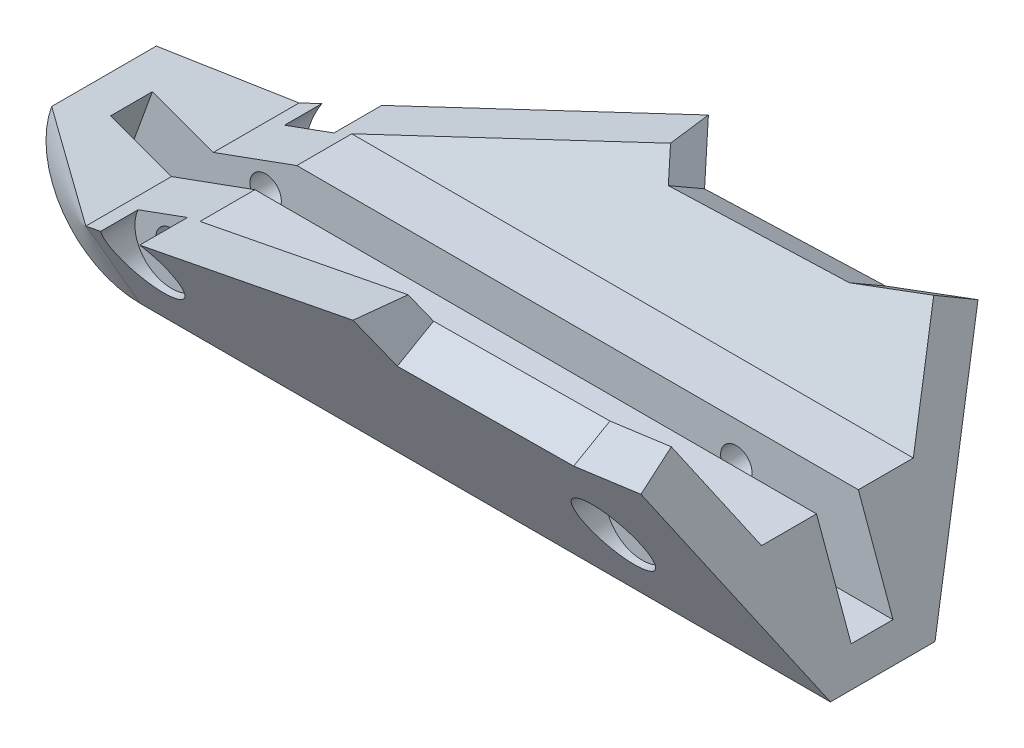
ISO-10303-21;
HEADER;
FILE_DESCRIPTION(('STEP AP214'),'2;1');
FILE_NAME('part.step','',(''),(''),'','','');
FILE_SCHEMA(('AUTOMOTIVE_DESIGN { 1 0 10303 214 1 1 1 1 }'));
ENDSEC;
DATA;
#1=APPLICATION_CONTEXT('core data for automotive mechanical design processes');
#2=APPLICATION_PROTOCOL_DEFINITION('international standard','automotive_design',2000,#1);
#3=PRODUCT_CONTEXT('',#1,'mechanical');
#4=PRODUCT('Part','Part','',(#3));
#5=PRODUCT_RELATED_PRODUCT_CATEGORY('part','',(#4));
#6=PRODUCT_DEFINITION_FORMATION('','',#4);
#7=PRODUCT_DEFINITION_CONTEXT('part definition',#1,'design');
#8=PRODUCT_DEFINITION('design','',#6,#7);
#9=PRODUCT_DEFINITION_SHAPE('','',#8);
#10=(LENGTH_UNIT() NAMED_UNIT(*) SI_UNIT(.MILLI.,.METRE.));
#11=(NAMED_UNIT(*) PLANE_ANGLE_UNIT() SI_UNIT($,.RADIAN.));
#12=(NAMED_UNIT(*) SI_UNIT($,.STERADIAN.) SOLID_ANGLE_UNIT());
#13=UNCERTAINTY_MEASURE_WITH_UNIT(LENGTH_MEASURE(1.E-05),#10,'distance_accuracy_value','');
#14=(GEOMETRIC_REPRESENTATION_CONTEXT(3) GLOBAL_UNCERTAINTY_ASSIGNED_CONTEXT((#13)) GLOBAL_UNIT_ASSIGNED_CONTEXT((#10,
#11,#12)) REPRESENTATION_CONTEXT('',''));
#15=CARTESIAN_POINT('',(0.,0.,0.));
#16=DIRECTION('',(0.,0.,1.));
#17=DIRECTION('',(1.,0.,0.));
#18=AXIS2_PLACEMENT_3D('',#15,#16,#17);
#19=CARTESIAN_POINT('',(66.,0.,-5.));
#20=DIRECTION('',(0.,0.500000000000001,0.866025403784438));
#21=DIRECTION('',(0.,-0.866025403784438,0.500000000000001));
#22=AXIS2_PLACEMENT_3D('',#19,#20,#21);
#23=PLANE('',#22);
#24=CARTESIAN_POINT('',(50.,8.23,-9.75159271543063));
#25=DIRECTION('',(0.,0.500000000000001,0.866025403784438));
#26=DIRECTION('',(0.,0.866025403784438,-0.500000000000001));
#27=AXIS2_PLACEMENT_3D('',#24,#25,#26);
#28=ELLIPSE('',#27,4.04145188432738,3.5);
#29=CARTESIAN_POINT('',(50.,11.73,-11.7723186575943));
#30=VERTEX_POINT('',#29);
#31=EDGE_CURVE('E311',#30,#30,#28,.T.);
#32=ORIENTED_EDGE('',*,*,#31,.T.);
#33=EDGE_LOOP('',(#32));
#34=FACE_BOUND('',#33,.T.);
#35=DIRECTION('',(0.38744925241058,-0.798381054136971,0.460945516521879));
#36=VECTOR('',#35,1.);
#37=CARTESIAN_POINT('',(32.3396465532428,20.7706687320701,-16.9919511837093));
#38=LINE('',#37,#36);
#39=CARTESIAN_POINT('',(32.3396465532428,20.7706687320701,-16.9919511837092));
#40=VERTEX_POINT('',#39);
#41=CARTESIAN_POINT('',(34.2768928152956,16.7787634613853,-14.6872236010999));
#42=VERTEX_POINT('',#41);
#43=EDGE_CURVE('E64',#40,#42,#38,.T.);
#44=ORIENTED_EDGE('',*,*,#43,.T.);
#45=DIRECTION('',(0.999659898363768,0.0225846342123478,-0.0130392446420483));
#46=VECTOR('',#45,1.);
#47=CARTESIAN_POINT('',(34.2768928152956,16.7787634613853,-14.6872236010999));
#48=LINE('',#47,#46);
#49=CARTESIAN_POINT('',(51.3645059177518,17.1648122486906,-14.9101089723709));
#50=VERTEX_POINT('',#49);
#51=EDGE_CURVE('E264',#42,#50,#48,.T.);
#52=ORIENTED_EDGE('',*,*,#51,.T.);
#53=DIRECTION('',(0.953741925422946,0.26035025401927,-0.150313289241614));
#54=VECTOR('',#53,1.);
#55=CARTESIAN_POINT('',(51.3645059177518,17.1648122486906,-14.9101089723709));
#56=LINE('',#55,#54);
#57=CARTESIAN_POINT('',(58.9944413211353,19.2476142808447,-16.1126152863038));
#58=VERTEX_POINT('',#57);
#59=EDGE_CURVE('E261',#50,#58,#56,.T.);
#60=ORIENTED_EDGE('',*,*,#59,.T.);
#61=DIRECTION('',(-0.300626578483226,0.825964736070554,-0.476870962711474));
#62=VECTOR('',#61,1.);
#63=CARTESIAN_POINT('',(66.,0.,-5.));
#64=LINE('',#63,#62);
#65=CARTESIAN_POINT('',(66.,0.,-5.));
#66=VERTEX_POINT('',#65);
#67=EDGE_CURVE('E360',#66,#58,#64,.T.);
#68=ORIENTED_EDGE('',*,*,#67,.F.);
#69=DIRECTION('',(-1.,0.,0.));
#70=VECTOR('',#69,1.);
#71=CARTESIAN_POINT('',(66.,0.,-5.));
#72=LINE('',#71,#70);
#73=CARTESIAN_POINT('',(0.,0.,-5.));
#74=VERTEX_POINT('',#73);
#75=EDGE_CURVE('E397',#66,#74,#72,.T.);
#76=ORIENTED_EDGE('',*,*,#75,.T.);
#77=DIRECTION('',(0.,0.866025403784438,-0.500000000000001));
#78=VECTOR('',#77,1.);
#79=CARTESIAN_POINT('',(0.,0.,-5.));
#80=LINE('',#79,#78);
#81=CARTESIAN_POINT('',(0.,9.,-10.1961524227066));
#82=VERTEX_POINT('',#81);
#83=EDGE_CURVE('E381',#74,#82,#80,.T.);
#84=ORIENTED_EDGE('',*,*,#83,.T.);
#85=DIRECTION('',(-0.921891033043755,-0.335540895264851,0.19372462620529));
#86=VECTOR('',#85,1.);
#87=CARTESIAN_POINT('',(52.3802973584582,28.0648691004916,-21.2032597299405));
#88=LINE('',#87,#86);
#89=CARTESIAN_POINT('',(1.80392717608658,9.65657579687941,-10.5752266357784));
#90=VERTEX_POINT('',#89);
#91=EDGE_CURVE('E332',#90,#82,#88,.T.);
#92=ORIENTED_EDGE('',*,*,#91,.F.);
#93=CARTESIAN_POINT('',(5.,8.23,-9.75159271543063));
#94=DIRECTION('',(0.,0.500000000000001,0.866025403784438));
#95=DIRECTION('',(0.,0.866025403784438,-0.500000000000001));
#96=AXIS2_PLACEMENT_3D('',#93,#94,#95);
#97=ELLIPSE('',#96,4.04145188432738,3.5);
#98=CARTESIAN_POINT('',(6.53134858004965,11.3772164727549,-11.5686389931737));
#99=VERTEX_POINT('',#98);
#100=EDGE_CURVE('E307',#90,#99,#97,.T.);
#101=ORIENTED_EDGE('',*,*,#100,.T.);
#102=EDGE_CURVE('E333',#40,#99,#88,.T.);
#103=ORIENTED_EDGE('',*,*,#102,.F.);
#104=EDGE_LOOP('',(#44,#52,#60,#68,#76,#84,#92,#101,#103));
#105=FACE_BOUND('',#104,.T.);
#106=ADVANCED_FACE('F41',(#34,#105),#23,.F.);
#107=CARTESIAN_POINT('',(66.,36.6410161513775,-21.5358983848623));
#108=DIRECTION('',(0.,-0.5,-0.866025403784438));
#109=DIRECTION('',(0.,0.866025403784438,-0.500000000000001));
#110=AXIS2_PLACEMENT_3D('',#107,#108,#109);
#111=PLANE('',#110);
#112=DIRECTION('',(0.38744925241058,-0.798381054136971,0.460945516521878));
#113=VECTOR('',#112,1.);
#114=CARTESIAN_POINT('',(31.6719095325118,24.1466130220143,-14.3222513747607));
#115=LINE('',#114,#113);
#116=CARTESIAN_POINT('',(33.1645322667471,21.0709025784571,-12.5464891222237));
#117=VERTEX_POINT('',#116);
#118=CARTESIAN_POINT('',(34.2768928152956,18.7787634613853,-11.2231219859621));
#119=VERTEX_POINT('',#118);
#120=EDGE_CURVE('E271',#117,#119,#115,.T.);
#121=ORIENTED_EDGE('',*,*,#120,.F.);
#122=DIRECTION('',(0.921891033043756,0.335540895264851,-0.19372462620529));
#123=VECTOR('',#122,1.);
#124=CARTESIAN_POINT('',(67.4926227342354,33.5653057078204,-19.7601361323252));
#125=LINE('',#124,#123);
#126=CARTESIAN_POINT('',(7.97825564815132,11.9038475772933,-7.25388744962561));
#127=VERTEX_POINT('',#126);
#128=EDGE_CURVE('E327',#127,#117,#125,.T.);
#129=ORIENTED_EDGE('',*,*,#128,.F.);
#130=DIRECTION('',(-1.,0.,0.));
#131=VECTOR('',#130,1.);
#132=CARTESIAN_POINT('',(66.,11.9038475772933,-7.25388744962561));
#133=LINE('',#132,#131);
#134=CARTESIAN_POINT('',(61.6673538086233,11.9038475772933,-7.25388744962561));
#135=VERTEX_POINT('',#134);
#136=EDGE_CURVE('E394',#135,#127,#133,.T.);
#137=ORIENTED_EDGE('',*,*,#136,.F.);
#138=DIRECTION('',(0.300626578483226,-0.825964736070555,0.476870962711474));
#139=VECTOR('',#138,1.);
#140=CARTESIAN_POINT('',(53.86904125469,33.3295352290744,-19.6240139829543));
#141=LINE('',#140,#139);
#142=CARTESIAN_POINT('',(58.3322894476615,21.0668616014637,-12.5441560630687));
#143=VERTEX_POINT('',#142);
#144=EDGE_CURVE('E347',#143,#135,#141,.T.);
#145=ORIENTED_EDGE('',*,*,#144,.F.);
#146=DIRECTION('',(0.953741925422946,0.26035025401927,-0.150313289241613));
#147=VECTOR('',#146,1.);
#148=CARTESIAN_POINT('',(70.4632481929715,24.3783425237668,-14.4560404649767));
#149=LINE('',#148,#147);
#150=CARTESIAN_POINT('',(51.3645059177518,19.1648122486906,-11.4460073572332));
#151=VERTEX_POINT('',#150);
#152=EDGE_CURVE('E274',#151,#143,#149,.T.);
#153=ORIENTED_EDGE('',*,*,#152,.F.);
#154=DIRECTION('',(0.999659898363768,0.0225846342123478,-0.0130392446420483));
#155=VECTOR('',#154,1.);
#156=CARTESIAN_POINT('',(66.5161258307042,19.5071224624129,-11.6436402512721));
#157=LINE('',#156,#155);
#158=EDGE_CURVE('E11',#119,#151,#157,.T.);
#159=ORIENTED_EDGE('',*,*,#158,.F.);
#160=EDGE_LOOP('',(#121,#129,#137,#145,#153,#159));
#161=FACE_BOUND('',#160,.T.);
#162=ADVANCED_FACE('F456',(#161),#111,.F.);
#163=CARTESIAN_POINT('',(55.3869223793366,29.1591911136914,66.));
#164=DIRECTION('',(0.939692620785907,0.342020143325673,0.));
#165=DIRECTION('',(-0.342020143325673,0.939692620785907,0.));
#166=AXIS2_PLACEMENT_3D('',#163,#164,#165);
#167=PLANE('',#166);
#168=ORIENTED_EDGE('',*,*,#67,.T.);
#169=DIRECTION('',(-0.16309947501443,0.448112124727044,0.878973312975219));
#170=VECTOR('',#169,1.);
#171=CARTESIAN_POINT('',(46.4023985942666,53.8439673377239,51.7482378021691));
#172=LINE('',#171,#170);
#173=EDGE_CURVE('E49',#58,#143,#172,.T.);
#174=ORIENTED_EDGE('',*,*,#173,.T.);
#175=ORIENTED_EDGE('',*,*,#144,.T.);
#176=DIRECTION('',(0.,0.,1.));
#177=VECTOR('',#176,1.);
#178=CARTESIAN_POINT('',(61.6673538086233,11.9038475772933,-2.));
#179=LINE('',#178,#177);
#180=CARTESIAN_POINT('',(61.6673538086233,11.9038475772933,-2.));
#181=VERTEX_POINT('',#180);
#182=EDGE_CURVE('E345',#135,#181,#179,.T.);
#183=ORIENTED_EDGE('',*,*,#182,.T.);
#184=DIRECTION('',(0.342020143325673,-0.939692620785907,0.));
#185=VECTOR('',#184,1.);
#186=CARTESIAN_POINT('',(65.0988607589331,2.47585971661573,-2.));
#187=LINE('',#186,#185);
#188=CARTESIAN_POINT('',(64.9794829404458,2.80384757729332,-2.));
#189=VERTEX_POINT('',#188);
#190=EDGE_CURVE('E349',#181,#189,#187,.T.);
#191=ORIENTED_EDGE('',*,*,#190,.T.);
#192=DIRECTION('',(0.,0.,1.));
#193=VECTOR('',#192,1.);
#194=CARTESIAN_POINT('',(64.9794829404458,2.80384757729332,-2.));
#195=LINE('',#194,#193);
#196=CARTESIAN_POINT('',(64.9794829404458,2.80384757729332,2.));
#197=VERTEX_POINT('',#196);
#198=EDGE_CURVE('E351',#189,#197,#195,.T.);
#199=ORIENTED_EDGE('',*,*,#198,.T.);
#200=DIRECTION('',(-0.342020143325673,0.939692620785907,0.));
#201=VECTOR('',#200,1.);
#202=CARTESIAN_POINT('',(65.0988607589331,2.47585971661573,2.));
#203=LINE('',#202,#201);
#204=CARTESIAN_POINT('',(61.6673538086233,11.9038475772933,2.));
#205=VERTEX_POINT('',#204);
#206=EDGE_CURVE('E353',#197,#205,#203,.T.);
#207=ORIENTED_EDGE('',*,*,#206,.T.);
#208=DIRECTION('',(0.,0.,1.));
#209=VECTOR('',#208,1.);
#210=CARTESIAN_POINT('',(61.6673538086233,11.9038475772933,2.));
#211=LINE('',#210,#209);
#212=CARTESIAN_POINT('',(61.6673538086233,11.9038475772933,7.25388744962561));
#213=VERTEX_POINT('',#212);
#214=EDGE_CURVE('E355',#205,#213,#211,.T.);
#215=ORIENTED_EDGE('',*,*,#214,.T.);
#216=DIRECTION('',(-0.300626578483226,0.825964736070555,0.476870962711474));
#217=VECTOR('',#216,1.);
#218=CARTESIAN_POINT('',(53.86904125469,33.3295352290744,19.6240139829543));
#219=LINE('',#218,#217);
#220=CARTESIAN_POINT('',(58.3322894476615,21.0668616014637,12.5441560630687));
#221=VERTEX_POINT('',#220);
#222=EDGE_CURVE('E357',#213,#221,#219,.T.);
#223=ORIENTED_EDGE('',*,*,#222,.T.);
#224=DIRECTION('',(-0.16309947501443,0.448112124727044,-0.878973312975219));
#225=VECTOR('',#224,1.);
#226=CARTESIAN_POINT('',(65.3259299327964,1.85199228877225,50.2341814076183));
#227=LINE('',#226,#225);
#228=CARTESIAN_POINT('',(58.9944413211353,19.2476142808447,16.1126152863038));
#229=VERTEX_POINT('',#228);
#230=EDGE_CURVE('E439',#229,#221,#227,.T.);
#231=ORIENTED_EDGE('',*,*,#230,.F.);
#232=DIRECTION('',(0.300626578483226,-0.825964736070554,-0.476870962711474));
#233=VECTOR('',#232,1.);
#234=CARTESIAN_POINT('',(66.,0.,5.));
#235=LINE('',#234,#233);
#236=CARTESIAN_POINT('',(66.,0.,5.));
#237=VERTEX_POINT('',#236);
#238=EDGE_CURVE('E363',#229,#237,#235,.T.);
#239=ORIENTED_EDGE('',*,*,#238,.T.);
#240=DIRECTION('',(0.,0.,-1.));
#241=VECTOR('',#240,1.);
#242=CARTESIAN_POINT('',(66.,0.,-5.));
#243=LINE('',#242,#241);
#244=EDGE_CURVE('E378',#237,#66,#243,.T.);
#245=ORIENTED_EDGE('',*,*,#244,.T.);
#246=EDGE_LOOP('',(#168,#174,#175,#183,#191,#199,#207,#215,#223,#231,#239,#245));
#247=FACE_BOUND('',#246,.T.);
#248=ADVANCED_FACE('F447',(#247),#167,.T.);
#249=CARTESIAN_POINT('',(55.3869223793366,29.1591911136914,66.));
#250=DIRECTION('',(-0.342020143325673,0.939692620785907,0.));
#251=DIRECTION('',(-0.939692620785907,-0.342020143325673,0.));
#252=AXIS2_PLACEMENT_3D('',#249,#250,#251);
#253=PLANE('',#252);
#254=ORIENTED_EDGE('',*,*,#128,.T.);
#255=DIRECTION('',(-0.18204160170962,-0.0662577244204458,-0.981055946010023));
#256=VECTOR('',#255,1.);
#257=CARTESIAN_POINT('',(48.0263742743884,26.4801706956057,67.5467331595463));
#258=LINE('',#257,#256);
#259=EDGE_CURVE('E443',#117,#40,#258,.T.);
#260=ORIENTED_EDGE('',*,*,#259,.T.);
#261=ORIENTED_EDGE('',*,*,#102,.T.);
#262=DIRECTION('',(0.,0.,-1.));
#263=VECTOR('',#262,1.);
#264=CARTESIAN_POINT('',(6.53134858004964,11.3772164727549,-7.));
#265=LINE('',#264,#263);
#266=CARTESIAN_POINT('',(6.53134858004964,11.3772164727549,-7.));
#267=VERTEX_POINT('',#266);
#268=EDGE_CURVE('E436',#267,#99,#265,.T.);
#269=ORIENTED_EDGE('',*,*,#268,.F.);
#270=DIRECTION('',(0.939692620785907,0.342020143325673,0.));
#271=VECTOR('',#270,1.);
#272=CARTESIAN_POINT('',(55.3869223793366,29.1591911136914,-7.00000000000001));
#273=LINE('',#272,#271);
#274=CARTESIAN_POINT('',(1.80392717608658,9.65657579687941,-7.));
#275=VERTEX_POINT('',#274);
#276=EDGE_CURVE('E305',#275,#267,#273,.T.);
#277=ORIENTED_EDGE('',*,*,#276,.F.);
#278=DIRECTION('',(0.,0.,-1.));
#279=VECTOR('',#278,1.);
#280=CARTESIAN_POINT('',(1.80392717608658,9.65657579687941,-7.));
#281=LINE('',#280,#279);
#282=EDGE_CURVE('E427',#90,#275,#281,.F.);
#283=ORIENTED_EDGE('',*,*,#282,.F.);
#284=ORIENTED_EDGE('',*,*,#91,.T.);
#285=DIRECTION('',(0.,0.,-1.));
#286=VECTOR('',#285,1.);
#287=CARTESIAN_POINT('',(0.,9.,0.));
#288=LINE('',#287,#286);
#289=CARTESIAN_POINT('',(0.,9.,-2.));
#290=VERTEX_POINT('',#289);
#291=EDGE_CURVE('E415',#290,#82,#288,.T.);
#292=ORIENTED_EDGE('',*,*,#291,.F.);
#293=DIRECTION('',(0.939692620785907,0.342020143325673,0.));
#294=VECTOR('',#293,1.);
#295=CARTESIAN_POINT('',(56.2880616204035,29.487178974369,-2.));
#296=LINE('',#295,#294);
#297=CARTESIAN_POINT('',(7.97825564815132,11.9038475772933,-2.));
#298=VERTEX_POINT('',#297);
#299=EDGE_CURVE('E330',#290,#298,#296,.T.);
#300=ORIENTED_EDGE('',*,*,#299,.T.);
#301=DIRECTION('',(0.,0.,-1.));
#302=VECTOR('',#301,1.);
#303=CARTESIAN_POINT('',(7.97825564815132,11.9038475772933,-2.));
#304=LINE('',#303,#302);
#305=EDGE_CURVE('E325',#298,#127,#304,.T.);
#306=ORIENTED_EDGE('',*,*,#305,.T.);
#307=EDGE_LOOP('',(#254,#260,#261,#269,#277,#283,#284,#292,#300,#306));
#308=FACE_BOUND('',#307,.T.);
#309=ADVANCED_FACE('F516',(#308),#253,.T.);
#310=DIRECTION('',(-0.18204160170962,-0.0662577244204458,0.981055946010023));
#311=VECTOR('',#310,1.);
#312=CARTESIAN_POINT('',(24.4520988316382,17.8998361400518,59.4994083750676));
#313=LINE('',#312,#311);
#314=CARTESIAN_POINT('',(33.1645322667471,21.0709025784571,12.5464891222236));
#315=VERTEX_POINT('',#314);
#316=CARTESIAN_POINT('',(32.3396465532428,20.7706687320701,16.9919511837093));
#317=VERTEX_POINT('',#316);
#318=EDGE_CURVE('E294',#315,#317,#313,.T.);
#319=ORIENTED_EDGE('',*,*,#318,.F.);
#320=DIRECTION('',(-0.921891033043756,-0.335540895264851,-0.19372462620529));
#321=VECTOR('',#320,1.);
#322=CARTESIAN_POINT('',(67.4926227342354,33.5653057078204,19.7601361323252));
#323=LINE('',#322,#321);
#324=CARTESIAN_POINT('',(7.97825564815131,11.9038475772933,7.25388744962561));
#325=VERTEX_POINT('',#324);
#326=EDGE_CURVE('E339',#315,#325,#323,.T.);
#327=ORIENTED_EDGE('',*,*,#326,.T.);
#328=DIRECTION('',(0.,0.,-1.));
#329=VECTOR('',#328,1.);
#330=CARTESIAN_POINT('',(7.97825564815132,11.9038475772933,2.));
#331=LINE('',#330,#329);
#332=CARTESIAN_POINT('',(7.97825564815132,11.9038475772933,2.));
#333=VERTEX_POINT('',#332);
#334=EDGE_CURVE('E341',#325,#333,#331,.T.);
#335=ORIENTED_EDGE('',*,*,#334,.T.);
#336=DIRECTION('',(-0.939692620785907,-0.342020143325673,0.));
#337=VECTOR('',#336,1.);
#338=CARTESIAN_POINT('',(56.2880616204035,29.487178974369,2.));
#339=LINE('',#338,#337);
#340=CARTESIAN_POINT('',(0.,9.,2.));
#341=VERTEX_POINT('',#340);
#342=EDGE_CURVE('E343',#333,#341,#339,.T.);
#343=ORIENTED_EDGE('',*,*,#342,.T.);
#344=CARTESIAN_POINT('',(0.,9.,10.1961524227066));
#345=VERTEX_POINT('',#344);
#346=EDGE_CURVE('E244',#345,#341,#288,.T.);
#347=ORIENTED_EDGE('',*,*,#346,.F.);
#348=DIRECTION('',(0.921891033043755,0.335540895264851,0.19372462620529));
#349=VECTOR('',#348,1.);
#350=CARTESIAN_POINT('',(52.3802973584582,28.0648691004916,21.2032597299405));
#351=LINE('',#350,#349);
#352=CARTESIAN_POINT('',(1.8039271760866,9.65657579687942,10.5752266357784));
#353=VERTEX_POINT('',#352);
#354=EDGE_CURVE('E336',#345,#353,#351,.T.);
#355=ORIENTED_EDGE('',*,*,#354,.T.);
#356=DIRECTION('',(0.,0.,1.));
#357=VECTOR('',#356,1.);
#358=CARTESIAN_POINT('',(1.80392717608658,9.65657579687941,7.));
#359=LINE('',#358,#357);
#360=CARTESIAN_POINT('',(1.80392717608658,9.65657579687941,7.));
#361=VERTEX_POINT('',#360);
#362=EDGE_CURVE('E424',#353,#361,#359,.F.);
#363=ORIENTED_EDGE('',*,*,#362,.T.);
#364=DIRECTION('',(-0.939692620785907,-0.342020143325673,0.));
#365=VECTOR('',#364,1.);
#366=CARTESIAN_POINT('',(55.3869223793366,29.1591911136914,7.));
#367=LINE('',#366,#365);
#368=CARTESIAN_POINT('',(6.53134858004964,11.3772164727549,7.));
#369=VERTEX_POINT('',#368);
#370=EDGE_CURVE('E319',#369,#361,#367,.T.);
#371=ORIENTED_EDGE('',*,*,#370,.F.);
#372=DIRECTION('',(0.,0.,1.));
#373=VECTOR('',#372,1.);
#374=CARTESIAN_POINT('',(6.53134858004964,11.3772164727549,7.));
#375=LINE('',#374,#373);
#376=CARTESIAN_POINT('',(6.53134858004964,11.3772164727549,11.5686389931737));
#377=VERTEX_POINT('',#376);
#378=EDGE_CURVE('E421',#369,#377,#375,.T.);
#379=ORIENTED_EDGE('',*,*,#378,.T.);
#380=EDGE_CURVE('E335',#377,#317,#351,.T.);
#381=ORIENTED_EDGE('',*,*,#380,.T.);
#382=EDGE_LOOP('',(#319,#327,#335,#343,#347,#355,#363,#371,#379,#381));
#383=FACE_BOUND('',#382,.T.);
#384=ADVANCED_FACE('F551',(#383),#253,.T.);
#385=CARTESIAN_POINT('',(66.,2.80384757729332,-2.));
#386=DIRECTION('',(0.,0.,-1.));
#387=DIRECTION('',(-1.,0.,0.));
#388=AXIS2_PLACEMENT_3D('',#385,#386,#387);
#389=PLANE('',#388);
#390=ORIENTED_EDGE('',*,*,#299,.F.);
#391=DIRECTION('',(0.939692620785907,-0.342020143325673,0.));
#392=VECTOR('',#391,1.);
#393=CARTESIAN_POINT('',(0.,9.,-2.));
#394=LINE('',#393,#392);
#395=CARTESIAN_POINT('',(-5.82247870888218,11.1192089396819,-2.));
#396=VERTEX_POINT('',#395);
#397=EDGE_CURVE('E238',#396,#290,#394,.T.);
#398=ORIENTED_EDGE('',*,*,#397,.F.);
#399=DIRECTION('',(0.342020143325673,0.939692620785907,0.));
#400=VECTOR('',#399,1.);
#401=CARTESIAN_POINT('',(-28.3958081683766,-50.900504032188,-2.00000000000001));
#402=LINE('',#401,#400);
#403=CARTESIAN_POINT('',(-8.05500049458868,4.98540574501281,-2.));
#404=VERTEX_POINT('',#403);
#405=EDGE_CURVE('E235',#404,#396,#402,.T.);
#406=ORIENTED_EDGE('',*,*,#405,.F.);
#407=CARTESIAN_POINT('',(0.,9.,-2.));
#408=DIRECTION('',(0.,0.,-1.));
#409=DIRECTION('',(0.,1.,0.));
#410=AXIS2_PLACEMENT_3D('',#407,#408,#409);
#411=CIRCLE('',#410,9.);
#412=CARTESIAN_POINT('',(-3.07818128993106,0.542766412926818,-2.));
#413=VERTEX_POINT('',#412);
#414=EDGE_CURVE('E920',#413,#404,#411,.T.);
#415=ORIENTED_EDGE('',*,*,#414,.F.);
#416=DIRECTION('',(0.342020143325673,0.939692620785907,0.));
#417=VECTOR('',#416,1.);
#418=CARTESIAN_POINT('',(-22.5733294594944,-53.0197129718699,-2.00000000000001));
#419=LINE('',#418,#417);
#420=CARTESIAN_POINT('',(-2.11920893968186,3.1775212911178,-2.));
#421=VERTEX_POINT('',#420);
#422=EDGE_CURVE('E913',#413,#421,#419,.T.);
#423=ORIENTED_EDGE('',*,*,#422,.T.);
#424=CARTESIAN_POINT('',(0.,9.,-2.));
#425=DIRECTION('',(0.,0.,1.));
#426=DIRECTION('',(0.,-1.,0.));
#427=AXIS2_PLACEMENT_3D('',#424,#425,#426);
#428=CIRCLE('',#427,6.19615242270668);
#429=CARTESIAN_POINT('',(0.,2.80384757729332,-2.));
#430=VERTEX_POINT('',#429);
#431=EDGE_CURVE('E259',#421,#430,#428,.T.);
#432=ORIENTED_EDGE('',*,*,#431,.T.);
#433=DIRECTION('',(-1.,0.,0.));
#434=VECTOR('',#433,1.);
#435=CARTESIAN_POINT('',(66.,2.80384757729332,-2.));
#436=LINE('',#435,#434);
#437=EDGE_CURVE('E412',#189,#430,#436,.T.);
#438=ORIENTED_EDGE('',*,*,#437,.F.);
#439=ORIENTED_EDGE('',*,*,#190,.F.);
#440=DIRECTION('',(-1.,0.,0.));
#441=VECTOR('',#440,1.);
#442=CARTESIAN_POINT('',(66.,11.9038475772933,-2.));
#443=LINE('',#442,#441);
#444=EDGE_CURVE('E380',#181,#298,#443,.T.);
#445=ORIENTED_EDGE('',*,*,#444,.T.);
#446=EDGE_LOOP('',(#390,#398,#406,#415,#423,#432,#438,#439,#445));
#447=FACE_BOUND('',#446,.T.);
#448=CARTESIAN_POINT('',(5.,8.23,-2.));
#449=DIRECTION('',(0.,0.,-1.));
#450=DIRECTION('',(-1.,0.,0.));
#451=AXIS2_PLACEMENT_3D('',#448,#449,#450);
#452=CIRCLE('',#451,1.5);
#453=CARTESIAN_POINT('',(3.5,8.23,-2.));
#454=VERTEX_POINT('',#453);
#455=EDGE_CURVE('E368',#454,#454,#452,.F.);
#456=ORIENTED_EDGE('',*,*,#455,.F.);
#457=EDGE_LOOP('',(#456));
#458=FACE_BOUND('',#457,.T.);
#459=CARTESIAN_POINT('',(50.,8.23,-2.));
#460=DIRECTION('',(0.,0.,-1.));
#461=DIRECTION('',(-1.,0.,0.));
#462=AXIS2_PLACEMENT_3D('',#459,#460,#461);
#463=CIRCLE('',#462,1.5);
#464=CARTESIAN_POINT('',(48.5,8.23,-2.));
#465=VERTEX_POINT('',#464);
#466=EDGE_CURVE('E374',#465,#465,#463,.F.);
#467=ORIENTED_EDGE('',*,*,#466,.F.);
#468=EDGE_LOOP('',(#467));
#469=FACE_BOUND('',#468,.T.);
#470=ADVANCED_FACE('F43',(#447,#458,#469),#389,.F.);
#471=CARTESIAN_POINT('',(66.,2.80384757729332,-2.));
#472=DIRECTION('',(0.,-1.,0.));
#473=DIRECTION('',(0.,0.,-1.));
#474=AXIS2_PLACEMENT_3D('',#471,#472,#473);
#475=PLANE('',#474);
#476=ORIENTED_EDGE('',*,*,#198,.F.);
#477=ORIENTED_EDGE('',*,*,#437,.T.);
#478=DIRECTION('',(0.,0.,1.));
#479=VECTOR('',#478,1.);
#480=CARTESIAN_POINT('',(0.,2.80384757729332,-2.));
#481=LINE('',#480,#479);
#482=CARTESIAN_POINT('',(0.,2.80384757729332,2.));
#483=VERTEX_POINT('',#482);
#484=EDGE_CURVE('E377',#430,#483,#481,.T.);
#485=ORIENTED_EDGE('',*,*,#484,.T.);
#486=DIRECTION('',(-1.,0.,0.));
#487=VECTOR('',#486,1.);
#488=CARTESIAN_POINT('',(66.,2.80384757729332,2.));
#489=LINE('',#488,#487);
#490=EDGE_CURVE('E409',#197,#483,#489,.T.);
#491=ORIENTED_EDGE('',*,*,#490,.F.);
#492=EDGE_LOOP('',(#476,#477,#485,#491));
#493=FACE_BOUND('',#492,.T.);
#494=ADVANCED_FACE('F473',(#493),#475,.F.);
#495=CARTESIAN_POINT('',(66.,2.80384757729332,2.));
#496=DIRECTION('',(0.,0.,1.));
#497=DIRECTION('',(1.,0.,0.));
#498=AXIS2_PLACEMENT_3D('',#495,#496,#497);
#499=PLANE('',#498);
#500=CARTESIAN_POINT('',(0.,9.,2.));
#501=DIRECTION('',(0.,0.,1.));
#502=DIRECTION('',(0.,-1.,0.));
#503=AXIS2_PLACEMENT_3D('',#500,#501,#502);
#504=CIRCLE('',#503,6.19615242270668);
#505=CARTESIAN_POINT('',(-2.11920893968185,3.17752129111782,2.));
#506=VERTEX_POINT('',#505);
#507=EDGE_CURVE('E257',#506,#483,#504,.T.);
#508=ORIENTED_EDGE('',*,*,#507,.F.);
#509=DIRECTION('',(0.342020143325673,0.939692620785907,0.));
#510=VECTOR('',#509,1.);
#511=CARTESIAN_POINT('',(-22.5733294594944,-53.0197129718699,1.99999999999999));
#512=LINE('',#511,#510);
#513=CARTESIAN_POINT('',(-3.07818128993105,0.542766412926839,2.));
#514=VERTEX_POINT('',#513);
#515=EDGE_CURVE('E56',#514,#506,#512,.T.);
#516=ORIENTED_EDGE('',*,*,#515,.F.);
#517=CARTESIAN_POINT('',(0.,9.,2.));
#518=DIRECTION('',(0.,0.,1.));
#519=DIRECTION('',(0.,-1.,0.));
#520=AXIS2_PLACEMENT_3D('',#517,#518,#519);
#521=CIRCLE('',#520,9.);
#522=CARTESIAN_POINT('',(-8.05500049458868,4.98540574501281,2.));
#523=VERTEX_POINT('',#522);
#524=EDGE_CURVE('E227',#523,#514,#521,.T.);
#525=ORIENTED_EDGE('',*,*,#524,.F.);
#526=DIRECTION('',(0.342020143325673,0.939692620785907,0.));
#527=VECTOR('',#526,1.);
#528=CARTESIAN_POINT('',(-28.3958081683766,-50.900504032188,1.99999999999999));
#529=LINE('',#528,#527);
#530=CARTESIAN_POINT('',(-5.82247870888218,11.1192089396818,2.));
#531=VERTEX_POINT('',#530);
#532=EDGE_CURVE('E218',#523,#531,#529,.T.);
#533=ORIENTED_EDGE('',*,*,#532,.T.);
#534=DIRECTION('',(-0.939692620785907,0.342020143325673,0.));
#535=VECTOR('',#534,1.);
#536=CARTESIAN_POINT('',(-5.82247870888218,11.1192089396818,2.));
#537=LINE('',#536,#535);
#538=EDGE_CURVE('E224',#341,#531,#537,.T.);
#539=ORIENTED_EDGE('',*,*,#538,.F.);
#540=ORIENTED_EDGE('',*,*,#342,.F.);
#541=DIRECTION('',(-1.,0.,0.));
#542=VECTOR('',#541,1.);
#543=CARTESIAN_POINT('',(66.,11.9038475772933,2.));
#544=LINE('',#543,#542);
#545=EDGE_CURVE('E406',#205,#333,#544,.T.);
#546=ORIENTED_EDGE('',*,*,#545,.F.);
#547=ORIENTED_EDGE('',*,*,#206,.F.);
#548=ORIENTED_EDGE('',*,*,#490,.T.);
#549=EDGE_LOOP('',(#508,#516,#525,#533,#539,#540,#546,#547,#548));
#550=FACE_BOUND('',#549,.T.);
#551=CARTESIAN_POINT('',(5.,8.23,2.));
#552=DIRECTION('',(0.,0.,1.));
#553=DIRECTION('',(1.,0.,0.));
#554=AXIS2_PLACEMENT_3D('',#551,#552,#553);
#555=CIRCLE('',#554,1.5);
#556=CARTESIAN_POINT('',(6.5,8.23,2.));
#557=VERTEX_POINT('',#556);
#558=EDGE_CURVE('E365',#557,#557,#555,.F.);
#559=ORIENTED_EDGE('',*,*,#558,.F.);
#560=EDGE_LOOP('',(#559));
#561=FACE_BOUND('',#560,.T.);
#562=CARTESIAN_POINT('',(50.,8.23,2.));
#563=DIRECTION('',(0.,0.,1.));
#564=DIRECTION('',(1.,0.,0.));
#565=AXIS2_PLACEMENT_3D('',#562,#563,#564);
#566=CIRCLE('',#565,1.5);
#567=CARTESIAN_POINT('',(51.5,8.23,2.));
#568=VERTEX_POINT('',#567);
#569=EDGE_CURVE('E371',#568,#568,#566,.F.);
#570=ORIENTED_EDGE('',*,*,#569,.F.);
#571=EDGE_LOOP('',(#570));
#572=FACE_BOUND('',#571,.T.);
#573=ADVANCED_FACE('F220',(#550,#561,#572),#499,.F.);
#574=CARTESIAN_POINT('',(66.,11.9038475772933,2.));
#575=DIRECTION('',(0.,-1.,0.));
#576=DIRECTION('',(0.,0.,-1.));
#577=AXIS2_PLACEMENT_3D('',#574,#575,#576);
#578=PLANE('',#577);
#579=ORIENTED_EDGE('',*,*,#334,.F.);
#580=DIRECTION('',(-1.,0.,0.));
#581=VECTOR('',#580,1.);
#582=CARTESIAN_POINT('',(66.,11.9038475772933,7.25388744962561));
#583=LINE('',#582,#581);
#584=EDGE_CURVE('E403',#213,#325,#583,.T.);
#585=ORIENTED_EDGE('',*,*,#584,.F.);
#586=ORIENTED_EDGE('',*,*,#214,.F.);
#587=ORIENTED_EDGE('',*,*,#545,.T.);
#588=EDGE_LOOP('',(#579,#585,#586,#587));
#589=FACE_BOUND('',#588,.T.);
#590=ADVANCED_FACE('F480',(#589),#578,.F.);
#591=CARTESIAN_POINT('',(66.,36.6410161513775,21.5358983848623));
#592=DIRECTION('',(0.,-0.5,0.866025403784438));
#593=DIRECTION('',(0.,-0.866025403784438,-0.500000000000001));
#594=AXIS2_PLACEMENT_3D('',#591,#592,#593);
#595=PLANE('',#594);
#596=DIRECTION('',(0.999659898363768,0.0225846342123478,0.0130392446420483));
#597=VECTOR('',#596,1.);
#598=CARTESIAN_POINT('',(66.5161258307042,19.5071224624129,11.6436402512721));
#599=LINE('',#598,#597);
#600=CARTESIAN_POINT('',(34.2768928152956,18.7787634613853,11.2231219859621));
#601=VERTEX_POINT('',#600);
#602=CARTESIAN_POINT('',(51.3645059177518,19.1648122486906,11.4460073572332));
#603=VERTEX_POINT('',#602);
#604=EDGE_CURVE('E296',#601,#603,#599,.T.);
#605=ORIENTED_EDGE('',*,*,#604,.T.);
#606=DIRECTION('',(0.953741925422946,0.26035025401927,0.150313289241613));
#607=VECTOR('',#606,1.);
#608=CARTESIAN_POINT('',(70.4632481929715,24.3783425237668,14.4560404649767));
#609=LINE('',#608,#607);
#610=EDGE_CURVE('E287',#603,#221,#609,.T.);
#611=ORIENTED_EDGE('',*,*,#610,.T.);
#612=ORIENTED_EDGE('',*,*,#222,.F.);
#613=ORIENTED_EDGE('',*,*,#584,.T.);
#614=ORIENTED_EDGE('',*,*,#326,.F.);
#615=DIRECTION('',(0.38744925241058,-0.798381054136971,-0.460945516521878));
#616=VECTOR('',#615,1.);
#617=CARTESIAN_POINT('',(31.6719095325118,24.1466130220143,14.3222513747607));
#618=LINE('',#617,#616);
#619=EDGE_CURVE('E291',#315,#601,#618,.T.);
#620=ORIENTED_EDGE('',*,*,#619,.T.);
#621=EDGE_LOOP('',(#605,#611,#612,#613,#614,#620));
#622=FACE_BOUND('',#621,.T.);
#623=ADVANCED_FACE('F485',(#622),#595,.F.);
#624=CARTESIAN_POINT('',(66.,0.,5.));
#625=DIRECTION('',(0.,0.500000000000001,-0.866025403784438));
#626=DIRECTION('',(0.,0.866025403784438,0.500000000000001));
#627=AXIS2_PLACEMENT_3D('',#624,#625,#626);
#628=PLANE('',#627);
#629=ORIENTED_EDGE('',*,*,#238,.F.);
#630=DIRECTION('',(0.953741925422946,0.26035025401927,0.150313289241614));
#631=VECTOR('',#630,1.);
#632=CARTESIAN_POINT('',(51.3645059177518,17.1648122486906,14.9101089723709));
#633=LINE('',#632,#631);
#634=CARTESIAN_POINT('',(51.3645059177518,17.1648122486906,14.9101089723709));
#635=VERTEX_POINT('',#634);
#636=EDGE_CURVE('E282',#635,#229,#633,.T.);
#637=ORIENTED_EDGE('',*,*,#636,.F.);
#638=DIRECTION('',(0.999659898363768,0.0225846342123478,0.0130392446420483));
#639=VECTOR('',#638,1.);
#640=CARTESIAN_POINT('',(34.2768928152956,16.7787634613853,14.6872236010999));
#641=LINE('',#640,#639);
#642=CARTESIAN_POINT('',(34.2768928152956,16.7787634613853,14.6872236010999));
#643=VERTEX_POINT('',#642);
#644=EDGE_CURVE('E279',#643,#635,#641,.T.);
#645=ORIENTED_EDGE('',*,*,#644,.F.);
#646=DIRECTION('',(0.38744925241058,-0.798381054136971,-0.460945516521879));
#647=VECTOR('',#646,1.);
#648=CARTESIAN_POINT('',(32.3396465532428,20.7706687320701,16.9919511837093));
#649=LINE('',#648,#647);
#650=EDGE_CURVE('E276',#317,#643,#649,.T.);
#651=ORIENTED_EDGE('',*,*,#650,.F.);
#652=ORIENTED_EDGE('',*,*,#380,.F.);
#653=CARTESIAN_POINT('',(5.,8.23,9.75159271543063));
#654=DIRECTION('',(0.,0.500000000000001,-0.866025403784438));
#655=DIRECTION('',(0.,0.866025403784438,0.500000000000001));
#656=AXIS2_PLACEMENT_3D('',#653,#654,#655);
#657=ELLIPSE('',#656,4.04145188432738,3.5);
#658=EDGE_CURVE('E321',#353,#377,#657,.F.);
#659=ORIENTED_EDGE('',*,*,#658,.F.);
#660=ORIENTED_EDGE('',*,*,#354,.F.);
#661=DIRECTION('',(0.,-0.866025403784438,-0.500000000000001));
#662=VECTOR('',#661,1.);
#663=CARTESIAN_POINT('',(0.,0.,5.));
#664=LINE('',#663,#662);
#665=CARTESIAN_POINT('',(0.,0.,5.));
#666=VERTEX_POINT('',#665);
#667=EDGE_CURVE('E384',#345,#666,#664,.T.);
#668=ORIENTED_EDGE('',*,*,#667,.T.);
#669=DIRECTION('',(-1.,0.,0.));
#670=VECTOR('',#669,1.);
#671=CARTESIAN_POINT('',(66.,0.,5.));
#672=LINE('',#671,#670);
#673=EDGE_CURVE('E400',#237,#666,#672,.T.);
#674=ORIENTED_EDGE('',*,*,#673,.F.);
#675=EDGE_LOOP('',(#629,#637,#645,#651,#652,#659,#660,#668,#674));
#676=FACE_BOUND('',#675,.T.);
#677=CARTESIAN_POINT('',(50.,8.23,9.75159271543063));
#678=DIRECTION('',(0.,0.500000000000001,-0.866025403784438));
#679=DIRECTION('',(0.,0.866025403784438,0.500000000000001));
#680=AXIS2_PLACEMENT_3D('',#677,#678,#679);
#681=ELLIPSE('',#680,4.04145188432738,3.5);
#682=CARTESIAN_POINT('',(50.,11.73,11.7723186575943));
#683=VERTEX_POINT('',#682);
#684=EDGE_CURVE('E324',#683,#683,#681,.F.);
#685=ORIENTED_EDGE('',*,*,#684,.F.);
#686=EDGE_LOOP('',(#685));
#687=FACE_BOUND('',#686,.T.);
#688=ADVANCED_FACE('F498',(#676,#687),#628,.F.);
#689=CARTESIAN_POINT('',(66.,11.9038475772933,-2.));
#690=DIRECTION('',(0.,-1.,0.));
#691=DIRECTION('',(0.,0.,-1.));
#692=AXIS2_PLACEMENT_3D('',#689,#690,#691);
#693=PLANE('',#692);
#694=ORIENTED_EDGE('',*,*,#305,.F.);
#695=ORIENTED_EDGE('',*,*,#444,.F.);
#696=ORIENTED_EDGE('',*,*,#182,.F.);
#697=ORIENTED_EDGE('',*,*,#136,.T.);
#698=EDGE_LOOP('',(#694,#695,#696,#697));
#699=FACE_BOUND('',#698,.T.);
#700=ADVANCED_FACE('F461',(#699),#693,.F.);
#701=CARTESIAN_POINT('',(66.,0.,-5.));
#702=DIRECTION('',(0.,1.,0.));
#703=DIRECTION('',(0.,0.,1.));
#704=AXIS2_PLACEMENT_3D('',#701,#702,#703);
#705=PLANE('',#704);
#706=DIRECTION('',(0.,0.,-1.));
#707=VECTOR('',#706,1.);
#708=CARTESIAN_POINT('',(0.,0.,-5.));
#709=LINE('',#708,#707);
#710=EDGE_CURVE('E387',#666,#74,#709,.T.);
#711=ORIENTED_EDGE('',*,*,#710,.T.);
#712=ORIENTED_EDGE('',*,*,#75,.F.);
#713=ORIENTED_EDGE('',*,*,#244,.F.);
#714=ORIENTED_EDGE('',*,*,#673,.T.);
#715=EDGE_LOOP('',(#711,#712,#713,#714));
#716=FACE_BOUND('',#715,.T.);
#717=ADVANCED_FACE('F505',(#716),#705,.F.);
#718=CARTESIAN_POINT('',(5.,8.23,66.));
#719=DIRECTION('',(0.,0.,-1.));
#720=DIRECTION('',(-1.,0.,0.));
#721=AXIS2_PLACEMENT_3D('',#718,#719,#720);
#722=CYLINDRICAL_SURFACE('',#721,1.5);
#723=CARTESIAN_POINT('',(5.,8.23,-7.00000000000001));
#724=DIRECTION('',(0.,0.,1.));
#725=DIRECTION('',(1.,0.,0.));
#726=AXIS2_PLACEMENT_3D('',#723,#724,#725);
#727=CIRCLE('',#726,1.5);
#728=CARTESIAN_POINT('',(6.5,8.23,-7.00000000000001));
#729=VERTEX_POINT('',#728);
#730=EDGE_CURVE('E308',#729,#729,#727,.T.);
#731=ORIENTED_EDGE('',*,*,#730,.F.);
#732=EDGE_LOOP('',(#731));
#733=FACE_BOUND('',#732,.T.);
#734=ORIENTED_EDGE('',*,*,#455,.T.);
#735=EDGE_LOOP('',(#734));
#736=FACE_BOUND('',#735,.T.);
#737=ADVANCED_FACE('F542',(#733,#736),#722,.F.);
#738=CARTESIAN_POINT('',(50.,8.23,66.));
#739=DIRECTION('',(0.,0.,-1.));
#740=DIRECTION('',(-1.,0.,0.));
#741=AXIS2_PLACEMENT_3D('',#738,#739,#740);
#742=CYLINDRICAL_SURFACE('',#741,1.5);
#743=CARTESIAN_POINT('',(50.,8.23,-7.00000000000001));
#744=DIRECTION('',(0.,0.,1.));
#745=DIRECTION('',(1.,0.,0.));
#746=AXIS2_PLACEMENT_3D('',#743,#744,#745);
#747=CIRCLE('',#746,1.5);
#748=CARTESIAN_POINT('',(51.5,8.23,-7.00000000000001));
#749=VERTEX_POINT('',#748);
#750=EDGE_CURVE('E302',#749,#749,#747,.T.);
#751=ORIENTED_EDGE('',*,*,#750,.F.);
#752=EDGE_LOOP('',(#751));
#753=FACE_BOUND('',#752,.T.);
#754=ORIENTED_EDGE('',*,*,#466,.T.);
#755=EDGE_LOOP('',(#754));
#756=FACE_BOUND('',#755,.T.);
#757=ADVANCED_FACE('F545',(#753,#756),#742,.F.);
#758=CARTESIAN_POINT('',(5.,8.23,7.));
#759=DIRECTION('',(0.,0.,-1.));
#760=DIRECTION('',(-1.,0.,0.));
#761=AXIS2_PLACEMENT_3D('',#758,#759,#760);
#762=CIRCLE('',#761,1.5);
#763=CARTESIAN_POINT('',(3.5,8.23,7.));
#764=VERTEX_POINT('',#763);
#765=EDGE_CURVE('E322',#764,#764,#762,.T.);
#766=ORIENTED_EDGE('',*,*,#765,.F.);
#767=EDGE_LOOP('',(#766));
#768=FACE_BOUND('',#767,.T.);
#769=ORIENTED_EDGE('',*,*,#558,.T.);
#770=EDGE_LOOP('',(#769));
#771=FACE_BOUND('',#770,.T.);
#772=ADVANCED_FACE('F547',(#768,#771),#722,.F.);
#773=CARTESIAN_POINT('',(50.,8.23,7.));
#774=DIRECTION('',(0.,0.,-1.));
#775=DIRECTION('',(-1.,0.,0.));
#776=AXIS2_PLACEMENT_3D('',#773,#774,#775);
#777=CIRCLE('',#776,1.5);
#778=CARTESIAN_POINT('',(48.5,8.23,7.));
#779=VERTEX_POINT('',#778);
#780=EDGE_CURVE('E315',#779,#779,#777,.T.);
#781=ORIENTED_EDGE('',*,*,#780,.F.);
#782=EDGE_LOOP('',(#781));
#783=FACE_BOUND('',#782,.T.);
#784=ORIENTED_EDGE('',*,*,#569,.T.);
#785=EDGE_LOOP('',(#784));
#786=FACE_BOUND('',#785,.T.);
#787=ADVANCED_FACE('F557',(#783,#786),#742,.F.);
#788=CARTESIAN_POINT('',(50.,8.23,7.));
#789=DIRECTION('',(0.,0.,1.));
#790=DIRECTION('',(1.,0.,0.));
#791=AXIS2_PLACEMENT_3D('',#788,#789,#790);
#792=CYLINDRICAL_SURFACE('',#791,3.5);
#793=CARTESIAN_POINT('',(50.,8.23,7.));
#794=DIRECTION('',(0.,0.,-1.));
#795=DIRECTION('',(-1.,0.,0.));
#796=AXIS2_PLACEMENT_3D('',#793,#794,#795);
#797=CIRCLE('',#796,3.5);
#798=CARTESIAN_POINT('',(46.5,8.23,7.));
#799=VERTEX_POINT('',#798);
#800=EDGE_CURVE('E316',#799,#799,#797,.T.);
#801=ORIENTED_EDGE('',*,*,#800,.T.);
#802=EDGE_LOOP('',(#801));
#803=FACE_BOUND('',#802,.T.);
#804=ORIENTED_EDGE('',*,*,#684,.T.);
#805=EDGE_LOOP('',(#804));
#806=FACE_BOUND('',#805,.T.);
#807=ADVANCED_FACE('F566',(#803,#806),#792,.F.);
#808=CARTESIAN_POINT('',(50.,8.23,7.));
#809=DIRECTION('',(0.,0.,-1.));
#810=DIRECTION('',(-1.,0.,0.));
#811=AXIS2_PLACEMENT_3D('',#808,#809,#810);
#812=PLANE('',#811);
#813=ORIENTED_EDGE('',*,*,#780,.T.);
#814=EDGE_LOOP('',(#813));
#815=FACE_BOUND('',#814,.T.);
#816=ORIENTED_EDGE('',*,*,#800,.F.);
#817=EDGE_LOOP('',(#816));
#818=FACE_BOUND('',#817,.T.);
#819=ADVANCED_FACE('F795',(#815,#818),#812,.F.);
#820=CARTESIAN_POINT('',(5.,8.23,7.));
#821=DIRECTION('',(0.,0.,1.));
#822=DIRECTION('',(1.,0.,0.));
#823=AXIS2_PLACEMENT_3D('',#820,#821,#822);
#824=CYLINDRICAL_SURFACE('',#823,3.5);
#825=ORIENTED_EDGE('',*,*,#658,.T.);
#826=ORIENTED_EDGE('',*,*,#378,.F.);
#827=CARTESIAN_POINT('',(5.,8.23,7.));
#828=DIRECTION('',(0.,0.,-1.));
#829=DIRECTION('',(-1.,0.,0.));
#830=AXIS2_PLACEMENT_3D('',#827,#828,#829);
#831=CIRCLE('',#830,3.5);
#832=EDGE_CURVE('E312',#369,#361,#831,.T.);
#833=ORIENTED_EDGE('',*,*,#832,.T.);
#834=ORIENTED_EDGE('',*,*,#362,.F.);
#835=EDGE_LOOP('',(#825,#826,#833,#834));
#836=FACE_BOUND('',#835,.T.);
#837=ADVANCED_FACE('F786',(#836),#824,.F.);
#838=CARTESIAN_POINT('',(5.,8.23,7.));
#839=DIRECTION('',(0.,0.,-1.));
#840=DIRECTION('',(-1.,0.,0.));
#841=AXIS2_PLACEMENT_3D('',#838,#839,#840);
#842=PLANE('',#841);
#843=ORIENTED_EDGE('',*,*,#370,.T.);
#844=ORIENTED_EDGE('',*,*,#832,.F.);
#845=EDGE_LOOP('',(#843,#844));
#846=FACE_BOUND('',#845,.T.);
#847=ORIENTED_EDGE('',*,*,#765,.T.);
#848=EDGE_LOOP('',(#847));
#849=FACE_BOUND('',#848,.T.);
#850=ADVANCED_FACE('F777',(#846,#849),#842,.F.);
#851=CARTESIAN_POINT('',(50.,8.23,-7.));
#852=DIRECTION('',(0.,0.,-1.));
#853=DIRECTION('',(-1.,0.,0.));
#854=AXIS2_PLACEMENT_3D('',#851,#852,#853);
#855=CYLINDRICAL_SURFACE('',#854,3.5);
#856=CARTESIAN_POINT('',(50.,8.23,-7.));
#857=DIRECTION('',(0.,0.,-1.));
#858=DIRECTION('',(-1.,0.,0.));
#859=AXIS2_PLACEMENT_3D('',#856,#857,#858);
#860=CIRCLE('',#859,3.5);
#861=CARTESIAN_POINT('',(46.5,8.23,-7.));
#862=VERTEX_POINT('',#861);
#863=EDGE_CURVE('E299',#862,#862,#860,.T.);
#864=ORIENTED_EDGE('',*,*,#863,.F.);
#865=EDGE_LOOP('',(#864));
#866=FACE_BOUND('',#865,.T.);
#867=ORIENTED_EDGE('',*,*,#31,.F.);
#868=EDGE_LOOP('',(#867));
#869=FACE_BOUND('',#868,.T.);
#870=ADVANCED_FACE('F769',(#866,#869),#855,.F.);
#871=CARTESIAN_POINT('',(50.,8.23,-7.));
#872=DIRECTION('',(0.,0.,1.));
#873=DIRECTION('',(-1.,0.,0.));
#874=AXIS2_PLACEMENT_3D('',#871,#872,#873);
#875=PLANE('',#874);
#876=ORIENTED_EDGE('',*,*,#750,.T.);
#877=EDGE_LOOP('',(#876));
#878=FACE_BOUND('',#877,.T.);
#879=ORIENTED_EDGE('',*,*,#863,.T.);
#880=EDGE_LOOP('',(#879));
#881=FACE_BOUND('',#880,.T.);
#882=ADVANCED_FACE('F761',(#878,#881),#875,.F.);
#883=CARTESIAN_POINT('',(5.,8.23,-7.));
#884=DIRECTION('',(0.,0.,-1.));
#885=DIRECTION('',(-1.,0.,0.));
#886=AXIS2_PLACEMENT_3D('',#883,#884,#885);
#887=CYLINDRICAL_SURFACE('',#886,3.5);
#888=ORIENTED_EDGE('',*,*,#268,.T.);
#889=ORIENTED_EDGE('',*,*,#100,.F.);
#890=ORIENTED_EDGE('',*,*,#282,.T.);
#891=CARTESIAN_POINT('',(5.,8.23,-7.));
#892=DIRECTION('',(0.,0.,-1.));
#893=DIRECTION('',(-1.,0.,0.));
#894=AXIS2_PLACEMENT_3D('',#891,#892,#893);
#895=CIRCLE('',#894,3.5);
#896=EDGE_CURVE('E300',#267,#275,#895,.T.);
#897=ORIENTED_EDGE('',*,*,#896,.F.);
#898=EDGE_LOOP('',(#888,#889,#890,#897));
#899=FACE_BOUND('',#898,.T.);
#900=ADVANCED_FACE('F532',(#899),#887,.F.);
#901=CARTESIAN_POINT('',(5.,8.23,-7.));
#902=DIRECTION('',(0.,0.,1.));
#903=DIRECTION('',(-1.,0.,0.));
#904=AXIS2_PLACEMENT_3D('',#901,#902,#903);
#905=PLANE('',#904);
#906=ORIENTED_EDGE('',*,*,#276,.T.);
#907=ORIENTED_EDGE('',*,*,#896,.T.);
#908=EDGE_LOOP('',(#906,#907));
#909=FACE_BOUND('',#908,.T.);
#910=ORIENTED_EDGE('',*,*,#730,.T.);
#911=EDGE_LOOP('',(#910));
#912=FACE_BOUND('',#911,.T.);
#913=ADVANCED_FACE('F536',(#909,#912),#905,.F.);
#914=CARTESIAN_POINT('',(34.2768928152956,49.7787634613853,-42.4704530486731));
#915=DIRECTION('',(0.0260784892840965,-0.865730867127593,-0.499829949181885));
#916=DIRECTION('',(0.,0.500000000000001,-0.866025403784438));
#917=AXIS2_PLACEMENT_3D('',#914,#915,#916);
#918=PLANE('',#917);
#919=DIRECTION('',(0.,-0.500000000000001,0.866025403784438));
#920=VECTOR('',#919,1.);
#921=CARTESIAN_POINT('',(34.2768928152956,49.7787634613853,-42.4704530486731));
#922=LINE('',#921,#920);
#923=EDGE_CURVE('E284',#601,#643,#922,.T.);
#924=ORIENTED_EDGE('',*,*,#923,.T.);
#925=ORIENTED_EDGE('',*,*,#644,.T.);
#926=DIRECTION('',(0.,-0.500000000000001,0.866025403784438));
#927=VECTOR('',#926,1.);
#928=CARTESIAN_POINT('',(51.3645059177518,50.1648122486907,-42.247567677402));
#929=LINE('',#928,#927);
#930=EDGE_CURVE('E285',#603,#635,#929,.T.);
#931=ORIENTED_EDGE('',*,*,#930,.F.);
#932=ORIENTED_EDGE('',*,*,#604,.F.);
#933=EDGE_LOOP('',(#924,#925,#931,#932));
#934=FACE_BOUND('',#933,.T.);
#935=ADVANCED_FACE('F491',(#934),#918,.F.);
#936=CARTESIAN_POINT('',(51.3645059177518,50.1648122486907,-42.247567677402));
#937=DIRECTION('',(0.300626578483226,-0.825964736070554,-0.476870962711474));
#938=DIRECTION('',(0.,0.500000000000001,-0.866025403784438));
#939=AXIS2_PLACEMENT_3D('',#936,#937,#938);
#940=PLANE('',#939);
#941=ORIENTED_EDGE('',*,*,#930,.T.);
#942=ORIENTED_EDGE('',*,*,#636,.T.);
#943=ORIENTED_EDGE('',*,*,#230,.T.);
#944=ORIENTED_EDGE('',*,*,#610,.F.);
#945=EDGE_LOOP('',(#941,#942,#943,#944));
#946=FACE_BOUND('',#945,.T.);
#947=ADVANCED_FACE('F489',(#946),#940,.F.);
#948=CARTESIAN_POINT('',(32.3396465532428,53.7706687320702,-40.1657254660637));
#949=DIRECTION('',(-0.921891033043756,-0.335540895264851,-0.19372462620529));
#950=DIRECTION('',(0.342020143325672,-0.939692620785907,0.));
#951=AXIS2_PLACEMENT_3D('',#948,#949,#950);
#952=PLANE('',#951);
#953=ORIENTED_EDGE('',*,*,#318,.T.);
#954=ORIENTED_EDGE('',*,*,#650,.T.);
#955=ORIENTED_EDGE('',*,*,#923,.F.);
#956=ORIENTED_EDGE('',*,*,#619,.F.);
#957=EDGE_LOOP('',(#953,#954,#955,#956));
#958=FACE_BOUND('',#957,.T.);
#959=ADVANCED_FACE('F703',(#958),#952,.F.);
#960=CARTESIAN_POINT('',(34.2768928152956,49.7787634613853,42.4704530486731));
#961=DIRECTION('',(-0.0260784892840965,0.865730867127593,-0.499829949181885));
#962=DIRECTION('',(0.,0.500000000000001,0.866025403784438));
#963=AXIS2_PLACEMENT_3D('',#960,#961,#962);
#964=PLANE('',#963);
#965=ORIENTED_EDGE('',*,*,#158,.T.);
#966=DIRECTION('',(0.,-0.500000000000001,-0.866025403784438));
#967=VECTOR('',#966,1.);
#968=CARTESIAN_POINT('',(51.3645059177518,50.1648122486907,42.247567677402));
#969=LINE('',#968,#967);
#970=EDGE_CURVE('E268',#151,#50,#969,.T.);
#971=ORIENTED_EDGE('',*,*,#970,.T.);
#972=ORIENTED_EDGE('',*,*,#51,.F.);
#973=DIRECTION('',(0.,-0.500000000000001,-0.866025403784438));
#974=VECTOR('',#973,1.);
#975=CARTESIAN_POINT('',(34.2768928152956,49.7787634613853,42.4704530486731));
#976=LINE('',#975,#974);
#977=EDGE_CURVE('E269',#119,#42,#976,.T.);
#978=ORIENTED_EDGE('',*,*,#977,.F.);
#979=EDGE_LOOP('',(#965,#971,#972,#978));
#980=FACE_BOUND('',#979,.T.);
#981=ADVANCED_FACE('F513',(#980),#964,.T.);
#982=CARTESIAN_POINT('',(51.3645059177518,50.1648122486907,42.247567677402));
#983=DIRECTION('',(-0.300626578483226,0.825964736070554,-0.476870962711474));
#984=DIRECTION('',(0.,0.500000000000001,0.866025403784438));
#985=AXIS2_PLACEMENT_3D('',#982,#983,#984);
#986=PLANE('',#985);
#987=ORIENTED_EDGE('',*,*,#152,.T.);
#988=ORIENTED_EDGE('',*,*,#173,.F.);
#989=ORIENTED_EDGE('',*,*,#59,.F.);
#990=ORIENTED_EDGE('',*,*,#970,.F.);
#991=EDGE_LOOP('',(#987,#988,#989,#990));
#992=FACE_BOUND('',#991,.T.);
#993=ADVANCED_FACE('F511',(#992),#986,.T.);
#994=CARTESIAN_POINT('',(32.3396465532428,53.7706687320702,40.1657254660637));
#995=DIRECTION('',(0.921891033043756,0.335540895264851,-0.19372462620529));
#996=DIRECTION('',(-0.342020143325672,0.939692620785907,0.));
#997=AXIS2_PLACEMENT_3D('',#994,#995,#996);
#998=PLANE('',#997);
#999=ORIENTED_EDGE('',*,*,#120,.T.);
#1000=ORIENTED_EDGE('',*,*,#977,.T.);
#1001=ORIENTED_EDGE('',*,*,#43,.F.);
#1002=ORIENTED_EDGE('',*,*,#259,.F.);
#1003=EDGE_LOOP('',(#999,#1000,#1001,#1002));
#1004=FACE_BOUND('',#1003,.T.);
#1005=ADVANCED_FACE('F615',(#1004),#998,.T.);
#1006=CARTESIAN_POINT('',(0.,9.,-10.1961524227066));
#1007=DIRECTION('',(0.,0.,1.));
#1008=DIRECTION('',(0.,-1.,0.));
#1009=AXIS2_PLACEMENT_3D('',#1006,#1007,#1008);
#1010=CONICAL_SURFACE('',#1009,0.,1.0471975511966);
#1011=ORIENTED_EDGE('',*,*,#83,.F.);
#1012=CARTESIAN_POINT('',(0.,9.,-5.));
#1013=DIRECTION('',(0.,0.,1.));
#1014=DIRECTION('',(0.,-1.,0.));
#1015=AXIS2_PLACEMENT_3D('',#1012,#1013,#1014);
#1016=CIRCLE('',#1015,9.);
#1017=CARTESIAN_POINT('',(-8.45723358707316,12.0781812899311,-5.));
#1018=VERTEX_POINT('',#1017);
#1019=EDGE_CURVE('E252',#1018,#74,#1016,.T.);
#1020=ORIENTED_EDGE('',*,*,#1019,.F.);
#1021=DIRECTION('',(-0.813797681349372,0.296198132726027,0.500000000000001));
#1022=VECTOR('',#1021,1.);
#1023=CARTESIAN_POINT('',(-8.45723358707316,12.0781812899311,-5.));
#1024=LINE('',#1023,#1022);
#1025=EDGE_CURVE('E523',#82,#1018,#1024,.T.);
#1026=ORIENTED_EDGE('',*,*,#1025,.F.);
#1027=EDGE_LOOP('',(#1011,#1020,#1026));
#1028=FACE_BOUND('',#1027,.T.);
#1029=ADVANCED_FACE('F525',(#1028),#1010,.T.);
#1030=CARTESIAN_POINT('',(0.,9.,-10.1961524227066));
#1031=DIRECTION('',(0.,0.,1.));
#1032=DIRECTION('',(0.,-1.,0.));
#1033=AXIS2_PLACEMENT_3D('',#1030,#1031,#1032);
#1034=CYLINDRICAL_SURFACE('',#1033,6.19615242270668);
#1035=ORIENTED_EDGE('',*,*,#431,.F.);
#1036=DIRECTION('',(0.,0.,1.));
#1037=VECTOR('',#1036,1.);
#1038=CARTESIAN_POINT('',(-2.11920893968185,3.17752129111782,-10.1961524227066));
#1039=LINE('',#1038,#1037);
#1040=EDGE_CURVE('E917',#421,#506,#1039,.T.);
#1041=ORIENTED_EDGE('',*,*,#1040,.T.);
#1042=ORIENTED_EDGE('',*,*,#507,.T.);
#1043=ORIENTED_EDGE('',*,*,#484,.F.);
#1044=EDGE_LOOP('',(#1035,#1041,#1042,#1043));
#1045=FACE_BOUND('',#1044,.T.);
#1046=ADVANCED_FACE('F614',(#1045),#1034,.F.);
#1047=CARTESIAN_POINT('',(0.,9.,5.));
#1048=DIRECTION('',(0.,0.,-1.));
#1049=DIRECTION('',(0.,1.,0.));
#1050=AXIS2_PLACEMENT_3D('',#1047,#1048,#1049);
#1051=CONICAL_SURFACE('',#1050,9.,1.0471975511966);
#1052=CARTESIAN_POINT('',(0.,9.,5.));
#1053=DIRECTION('',(0.,0.,1.));
#1054=DIRECTION('',(0.,-1.,0.));
#1055=AXIS2_PLACEMENT_3D('',#1052,#1053,#1054);
#1056=CIRCLE('',#1055,9.);
#1057=CARTESIAN_POINT('',(-8.45723358707316,12.0781812899311,5.));
#1058=VERTEX_POINT('',#1057);
#1059=EDGE_CURVE('E255',#1058,#666,#1056,.T.);
#1060=ORIENTED_EDGE('',*,*,#1059,.T.);
#1061=ORIENTED_EDGE('',*,*,#667,.F.);
#1062=DIRECTION('',(0.813797681349372,-0.296198132726027,0.500000000000001));
#1063=VECTOR('',#1062,1.);
#1064=CARTESIAN_POINT('',(0.,9.,10.1961524227066));
#1065=LINE('',#1064,#1063);
#1066=EDGE_CURVE('E245',#1058,#345,#1065,.T.);
#1067=ORIENTED_EDGE('',*,*,#1066,.F.);
#1068=EDGE_LOOP('',(#1060,#1061,#1067));
#1069=FACE_BOUND('',#1068,.T.);
#1070=ADVANCED_FACE('F622',(#1069),#1051,.T.);
#1071=CARTESIAN_POINT('',(0.,9.,-10.1961524227066));
#1072=DIRECTION('',(0.,0.,1.));
#1073=DIRECTION('',(0.,-1.,0.));
#1074=AXIS2_PLACEMENT_3D('',#1071,#1072,#1073);
#1075=CYLINDRICAL_SURFACE('',#1074,9.);
#1076=ORIENTED_EDGE('',*,*,#414,.T.);
#1077=DIRECTION('',(0.,0.,1.));
#1078=VECTOR('',#1077,1.);
#1079=CARTESIAN_POINT('',(-8.05500049458868,4.98540574501281,-10.1961524227066));
#1080=LINE('',#1079,#1078);
#1081=EDGE_CURVE('E527',#404,#523,#1080,.T.);
#1082=ORIENTED_EDGE('',*,*,#1081,.T.);
#1083=ORIENTED_EDGE('',*,*,#524,.T.);
#1084=DIRECTION('',(0.,0.,1.));
#1085=VECTOR('',#1084,1.);
#1086=CARTESIAN_POINT('',(-3.07818128993105,0.54276641292684,-10.1961524227066));
#1087=LINE('',#1086,#1085);
#1088=EDGE_CURVE('E915',#514,#413,#1087,.F.);
#1089=ORIENTED_EDGE('',*,*,#1088,.T.);
#1090=EDGE_LOOP('',(#1076,#1082,#1083,#1089));
#1091=FACE_BOUND('',#1090,.T.);
#1092=DIRECTION('',(0.,0.,1.));
#1093=VECTOR('',#1092,1.);
#1094=CARTESIAN_POINT('',(-8.45723358707316,12.0781812899311,5.));
#1095=LINE('',#1094,#1093);
#1096=EDGE_CURVE('E247',#1018,#1058,#1095,.T.);
#1097=ORIENTED_EDGE('',*,*,#1096,.F.);
#1098=ORIENTED_EDGE('',*,*,#1019,.T.);
#1099=ORIENTED_EDGE('',*,*,#710,.F.);
#1100=ORIENTED_EDGE('',*,*,#1059,.F.);
#1101=EDGE_LOOP('',(#1097,#1098,#1099,#1100));
#1102=FACE_BOUND('',#1101,.T.);
#1103=ADVANCED_FACE('F625',(#1091,#1102),#1075,.T.);
#1104=CARTESIAN_POINT('',(-8.45723358707316,12.0781812899311,0.));
#1105=DIRECTION('',(-0.342020143325673,-0.939692620785907,0.));
#1106=DIRECTION('',(0.,0.,-1.));
#1107=AXIS2_PLACEMENT_3D('',#1104,#1105,#1106);
#1108=PLANE('',#1107);
#1109=ORIENTED_EDGE('',*,*,#1025,.T.);
#1110=ORIENTED_EDGE('',*,*,#1096,.T.);
#1111=ORIENTED_EDGE('',*,*,#1066,.T.);
#1112=ORIENTED_EDGE('',*,*,#346,.T.);
#1113=ORIENTED_EDGE('',*,*,#538,.T.);
#1114=DIRECTION('',(0.,0.,-1.));
#1115=VECTOR('',#1114,1.);
#1116=CARTESIAN_POINT('',(-5.82247870888218,11.1192089396819,-2.));
#1117=LINE('',#1116,#1115);
#1118=EDGE_CURVE('E232',#531,#396,#1117,.T.);
#1119=ORIENTED_EDGE('',*,*,#1118,.T.);
#1120=ORIENTED_EDGE('',*,*,#397,.T.);
#1121=ORIENTED_EDGE('',*,*,#291,.T.);
#1122=EDGE_LOOP('',(#1109,#1110,#1111,#1112,#1113,#1119,#1120,#1121));
#1123=FACE_BOUND('',#1122,.T.);
#1124=ADVANCED_FACE('F241',(#1123),#1108,.F.);
#1125=CARTESIAN_POINT('',(-28.3958081683766,-50.900504032188,-2.00000000000001));
#1126=DIRECTION('',(-0.939692620785907,0.342020143325673,0.));
#1127=DIRECTION('',(-0.342020143325673,-0.939692620785907,0.));
#1128=AXIS2_PLACEMENT_3D('',#1125,#1126,#1127);
#1129=PLANE('',#1128);
#1130=ORIENTED_EDGE('',*,*,#405,.T.);
#1131=ORIENTED_EDGE('',*,*,#1118,.F.);
#1132=ORIENTED_EDGE('',*,*,#532,.F.);
#1133=ORIENTED_EDGE('',*,*,#1081,.F.);
#1134=EDGE_LOOP('',(#1130,#1131,#1132,#1133));
#1135=FACE_BOUND('',#1134,.T.);
#1136=ADVANCED_FACE('F233',(#1135),#1129,.F.);
#1137=CARTESIAN_POINT('',(-22.5733294594944,-53.0197129718699,-2.00000000000001));
#1138=DIRECTION('',(0.939692620785907,-0.342020143325673,0.));
#1139=DIRECTION('',(0.342020143325673,0.939692620785907,0.));
#1140=AXIS2_PLACEMENT_3D('',#1137,#1138,#1139);
#1141=PLANE('',#1140);
#1142=ORIENTED_EDGE('',*,*,#422,.F.);
#1143=ORIENTED_EDGE('',*,*,#1088,.F.);
#1144=ORIENTED_EDGE('',*,*,#515,.T.);
#1145=ORIENTED_EDGE('',*,*,#1040,.F.);
#1146=EDGE_LOOP('',(#1142,#1143,#1144,#1145));
#1147=FACE_BOUND('',#1146,.T.);
#1148=ADVANCED_FACE('F666',(#1147),#1141,.F.);
#1149=CLOSED_SHELL('',(#106,#162,#248,#309,#384,#470,#494,#573,#590,#623,#688,#700,#717,#737,
#757,#772,#787,#807,#819,#837,#850,#870,#882,#900,#913,#935,#947,#959,#981,#993,#1005,#1029,
#1046,#1070,#1103,#1124,#1136,#1148));
#1150=MANIFOLD_SOLID_BREP('B2',#1149);
#1151=ADVANCED_BREP_SHAPE_REPRESENTATION('',(#18,#1150),#14);
#1152=SHAPE_DEFINITION_REPRESENTATION(#9,#1151);
ENDSEC;
END-ISO-10303-21;
